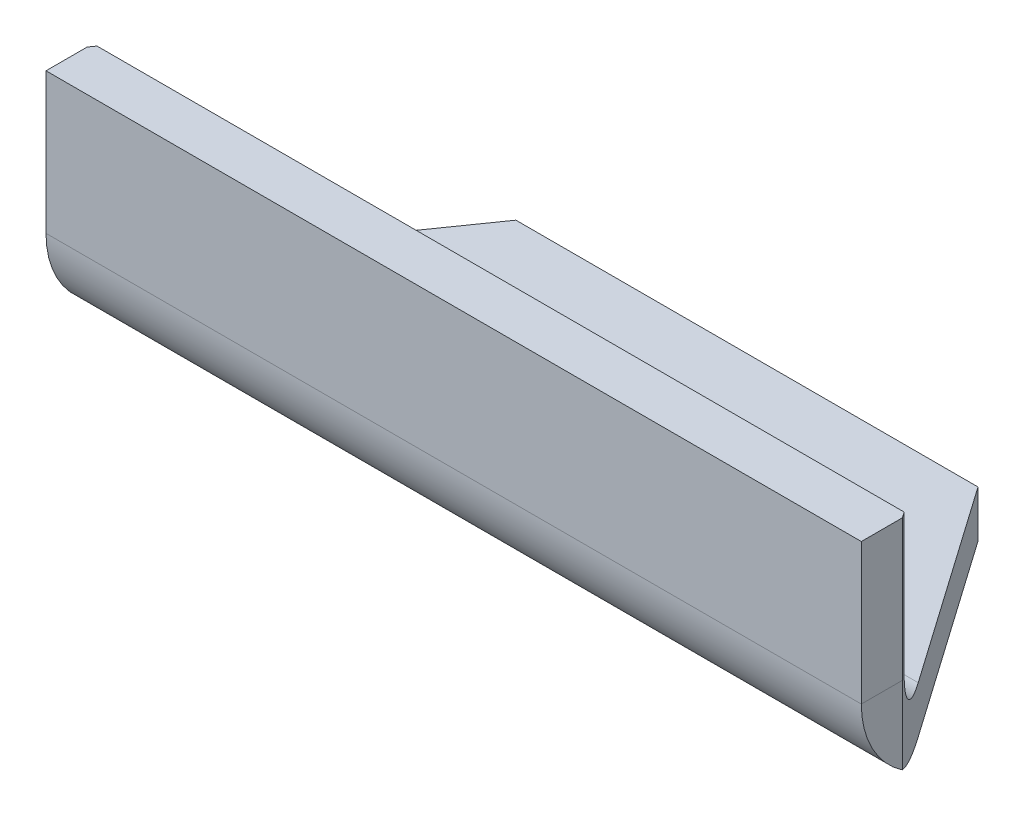
ISO-10303-21;
HEADER;
FILE_DESCRIPTION(('STEP AP214'),'2;1');
FILE_NAME('part.step','',(''),(''),'','','');
FILE_SCHEMA(('AUTOMOTIVE_DESIGN { 1 0 10303 214 1 1 1 1 }'));
ENDSEC;
DATA;
#1=APPLICATION_CONTEXT('core data for automotive mechanical design processes');
#2=APPLICATION_PROTOCOL_DEFINITION('international standard','automotive_design',2000,#1);
#3=PRODUCT_CONTEXT('',#1,'mechanical');
#4=PRODUCT('Part','Part','',(#3));
#5=PRODUCT_RELATED_PRODUCT_CATEGORY('part','',(#4));
#6=PRODUCT_DEFINITION_FORMATION('','',#4);
#7=PRODUCT_DEFINITION_CONTEXT('part definition',#1,'design');
#8=PRODUCT_DEFINITION('design','',#6,#7);
#9=PRODUCT_DEFINITION_SHAPE('','',#8);
#10=(LENGTH_UNIT() NAMED_UNIT(*) SI_UNIT(.MILLI.,.METRE.));
#11=(NAMED_UNIT(*) PLANE_ANGLE_UNIT() SI_UNIT($,.RADIAN.));
#12=(NAMED_UNIT(*) SI_UNIT($,.STERADIAN.) SOLID_ANGLE_UNIT());
#13=UNCERTAINTY_MEASURE_WITH_UNIT(LENGTH_MEASURE(1.E-05),#10,'distance_accuracy_value','');
#14=(GEOMETRIC_REPRESENTATION_CONTEXT(3) GLOBAL_UNCERTAINTY_ASSIGNED_CONTEXT((#13)) GLOBAL_UNIT_ASSIGNED_CONTEXT((#10,
#11,#12)) REPRESENTATION_CONTEXT('',''));
#15=CARTESIAN_POINT('',(0.,0.,0.));
#16=DIRECTION('',(0.,0.,1.));
#17=DIRECTION('',(1.,0.,0.));
#18=AXIS2_PLACEMENT_3D('',#15,#16,#17);
#19=CARTESIAN_POINT('',(0.,-8.,0.));
#20=DIRECTION('',(0.,-1.,0.));
#21=DIRECTION('',(0.,0.,-1.));
#22=AXIS2_PLACEMENT_3D('',#19,#20,#21);
#23=PLANE('',#22);
#24=DIRECTION('',(-1.,0.,0.));
#25=VECTOR('',#24,1.);
#26=CARTESIAN_POINT('',(-69.5,-8.,-25.));
#27=LINE('',#26,#25);
#28=CARTESIAN_POINT('',(39.3910758569819,-8.,-25.));
#29=VERTEX_POINT('',#28);
#30=CARTESIAN_POINT('',(-39.3910758569819,-8.,-25.));
#31=VERTEX_POINT('',#30);
#32=EDGE_CURVE('E168',#29,#31,#27,.T.);
#33=ORIENTED_EDGE('',*,*,#32,.F.);
#34=DIRECTION('',(0.573576436351051,0.,0.819152044288988));
#35=VECTOR('',#34,1.);
#36=CARTESIAN_POINT('',(38.1779663934933,-8.,-26.7324998622413));
#37=LINE('',#36,#35);
#38=CARTESIAN_POINT('',(63.1981321561124,-8.00000000000003,9.00000000000001));
#39=VERTEX_POINT('',#38);
#40=EDGE_CURVE('E196',#39,#29,#37,.F.);
#41=ORIENTED_EDGE('',*,*,#40,.F.);
#42=DIRECTION('',(1.,0.,0.));
#43=VECTOR('',#42,1.);
#44=CARTESIAN_POINT('',(69.5,-8.00000000000003,9.00000000000001));
#45=LINE('',#44,#43);
#46=CARTESIAN_POINT('',(-63.1981321561124,-8.00000000000003,9.00000000000001));
#47=VERTEX_POINT('',#46);
#48=EDGE_CURVE('E81',#39,#47,#45,.F.);
#49=ORIENTED_EDGE('',*,*,#48,.T.);
#50=DIRECTION('',(-0.573576436351051,0.,0.819152044288988));
#51=VECTOR('',#50,1.);
#52=CARTESIAN_POINT('',(-38.1779663934933,-8.,-26.7324998622413));
#53=LINE('',#52,#51);
#54=EDGE_CURVE('E13',#47,#31,#53,.F.);
#55=ORIENTED_EDGE('',*,*,#54,.T.);
#56=EDGE_LOOP('',(#33,#41,#49,#55));
#57=FACE_BOUND('',#56,.T.);
#58=ADVANCED_FACE('F58',(#57),#23,.T.);
#59=CARTESIAN_POINT('',(0.,0.,0.));
#60=DIRECTION('',(0.,-1.,0.));
#61=DIRECTION('',(0.,0.,-1.));
#62=AXIS2_PLACEMENT_3D('',#59,#60,#61);
#63=PLANE('',#62);
#64=DIRECTION('',(-0.573576436351051,0.,-0.819152044288988));
#65=VECTOR('',#64,1.);
#66=CARTESIAN_POINT('',(39.3910758569819,0.,-25.));
#67=LINE('',#66,#65);
#68=CARTESIAN_POINT('',(39.3910758569819,0.,-25.));
#69=VERTEX_POINT('',#68);
#70=CARTESIAN_POINT('',(63.1981321561124,0.,9.00000000000001));
#71=VERTEX_POINT('',#70);
#72=EDGE_CURVE('E203',#69,#71,#67,.F.);
#73=ORIENTED_EDGE('',*,*,#72,.F.);
#74=DIRECTION('',(-1.,0.,0.));
#75=VECTOR('',#74,1.);
#76=CARTESIAN_POINT('',(-69.5,0.,-25.));
#77=LINE('',#76,#75);
#78=CARTESIAN_POINT('',(-39.3910758569819,0.,-25.));
#79=VERTEX_POINT('',#78);
#80=EDGE_CURVE('E171',#69,#79,#77,.T.);
#81=ORIENTED_EDGE('',*,*,#80,.T.);
#82=DIRECTION('',(0.573576436351051,0.,-0.819152044288988));
#83=VECTOR('',#82,1.);
#84=CARTESIAN_POINT('',(-39.3910758569819,0.,-25.));
#85=LINE('',#84,#83);
#86=CARTESIAN_POINT('',(-63.1981321561124,0.,9.00000000000001));
#87=VERTEX_POINT('',#86);
#88=EDGE_CURVE('E175',#79,#87,#85,.F.);
#89=ORIENTED_EDGE('',*,*,#88,.T.);
#90=DIRECTION('',(1.,0.,0.));
#91=VECTOR('',#90,1.);
#92=CARTESIAN_POINT('',(69.5,0.,9.00000000000001));
#93=LINE('',#92,#91);
#94=EDGE_CURVE('E160',#71,#87,#93,.F.);
#95=ORIENTED_EDGE('',*,*,#94,.F.);
#96=EDGE_LOOP('',(#73,#81,#89,#95));
#97=FACE_BOUND('',#96,.T.);
#98=ADVANCED_FACE('F261',(#97),#63,.F.);
#99=CARTESIAN_POINT('',(-69.5,-8.,-25.));
#100=DIRECTION('',(0.,0.,-1.));
#101=DIRECTION('',(-1.,0.,0.));
#102=AXIS2_PLACEMENT_3D('',#99,#100,#101);
#103=PLANE('',#102);
#104=ORIENTED_EDGE('',*,*,#80,.F.);
#105=DIRECTION('',(0.,1.,0.));
#106=VECTOR('',#105,1.);
#107=CARTESIAN_POINT('',(39.3910758569819,-8.,-25.));
#108=LINE('',#107,#106);
#109=EDGE_CURVE('E201',#29,#69,#108,.T.);
#110=ORIENTED_EDGE('',*,*,#109,.F.);
#111=ORIENTED_EDGE('',*,*,#32,.T.);
#112=DIRECTION('',(0.,1.,0.));
#113=VECTOR('',#112,1.);
#114=CARTESIAN_POINT('',(-39.3910758569819,-8.,-25.));
#115=LINE('',#114,#113);
#116=EDGE_CURVE('E170',#31,#79,#115,.T.);
#117=ORIENTED_EDGE('',*,*,#116,.T.);
#118=EDGE_LOOP('',(#104,#110,#111,#117));
#119=FACE_BOUND('',#118,.T.);
#120=ADVANCED_FACE('F200',(#119),#103,.T.);
#121=CARTESIAN_POINT('',(69.5,7.99999999999997,9.00000000000001));
#122=DIRECTION('',(-1.,0.,0.));
#123=DIRECTION('',(0.,0.,1.));
#124=AXIS2_PLACEMENT_3D('',#121,#122,#123);
#125=PLANE('',#124);
#126=CARTESIAN_POINT('',(69.5,7.99999999999997,9.00000000000001));
#127=DIRECTION('',(1.,0.,0.));
#128=DIRECTION('',(0.,0.,-1.));
#129=AXIS2_PLACEMENT_3D('',#126,#127,#128);
#130=CIRCLE('',#129,16.);
#131=CARTESIAN_POINT('',(69.5,7.99999999999997,25.));
#132=VERTEX_POINT('',#131);
#133=CARTESIAN_POINT('',(69.5,-5.22875655532285,18.0000000000002));
#134=VERTEX_POINT('',#133);
#135=EDGE_CURVE('E155',#132,#134,#130,.T.);
#136=ORIENTED_EDGE('',*,*,#135,.T.);
#137=DIRECTION('',(0.,-1.,0.));
#138=VECTOR('',#137,1.);
#139=CARTESIAN_POINT('',(69.5,7.99999999999997,18.0000000000002));
#140=LINE('',#139,#138);
#141=CARTESIAN_POINT('',(69.5,7.99999999999997,18.0000000000002));
#142=VERTEX_POINT('',#141);
#143=EDGE_CURVE('E141',#142,#134,#140,.T.);
#144=ORIENTED_EDGE('',*,*,#143,.F.);
#145=DIRECTION('',(0.,0.,-1.));
#146=VECTOR('',#145,1.);
#147=CARTESIAN_POINT('',(69.5,7.99999999999997,17.));
#148=LINE('',#147,#146);
#149=EDGE_CURVE('E159',#142,#132,#148,.F.);
#150=ORIENTED_EDGE('',*,*,#149,.T.);
#151=EDGE_LOOP('',(#136,#144,#150));
#152=FACE_BOUND('',#151,.T.);
#153=ADVANCED_FACE('F158',(#152),#125,.F.);
#154=CARTESIAN_POINT('',(69.5,7.99999999999997,9.00000000000001));
#155=DIRECTION('',(1.,0.,0.));
#156=DIRECTION('',(0.,0.,1.));
#157=AXIS2_PLACEMENT_3D('',#154,#155,#156);
#158=CYLINDRICAL_SURFACE('',#157,16.);
#159=ORIENTED_EDGE('',*,*,#48,.F.);
#160=CARTESIAN_POINT('',(63.1981321561124,7.99999999999997,9.00000000000001));
#161=DIRECTION('',(0.819152044288988,0.,-0.573576436351051));
#162=DIRECTION('',(-0.573576436351051,0.,-0.819152044288988));
#163=AXIS2_PLACEMENT_3D('',#160,#161,#162);
#164=ELLIPSE('',#163,19.5323934201834,16.);
#165=EDGE_CURVE('E144',#134,#39,#164,.T.);
#166=ORIENTED_EDGE('',*,*,#165,.F.);
#167=ORIENTED_EDGE('',*,*,#135,.F.);
#168=DIRECTION('',(1.,0.,0.));
#169=VECTOR('',#168,1.);
#170=CARTESIAN_POINT('',(-69.5,7.99999999999997,25.));
#171=LINE('',#170,#169);
#172=CARTESIAN_POINT('',(-69.5,7.99999999999997,25.));
#173=VERTEX_POINT('',#172);
#174=EDGE_CURVE('E225',#132,#173,#171,.F.);
#175=ORIENTED_EDGE('',*,*,#174,.T.);
#176=CARTESIAN_POINT('',(-69.5,7.99999999999997,9.00000000000001));
#177=DIRECTION('',(1.,0.,0.));
#178=DIRECTION('',(0.,0.,-1.));
#179=AXIS2_PLACEMENT_3D('',#176,#177,#178);
#180=CIRCLE('',#179,16.);
#181=CARTESIAN_POINT('',(-69.5,-5.22875655532285,18.0000000000002));
#182=VERTEX_POINT('',#181);
#183=EDGE_CURVE('E162',#182,#173,#180,.F.);
#184=ORIENTED_EDGE('',*,*,#183,.F.);
#185=CARTESIAN_POINT('',(-63.1981321561124,7.99999999999997,9.00000000000001));
#186=DIRECTION('',(0.819152044288988,0.,0.573576436351051));
#187=DIRECTION('',(0.573576436351051,0.,-0.819152044288988));
#188=AXIS2_PLACEMENT_3D('',#185,#186,#187);
#189=ELLIPSE('',#188,19.5323934201834,16.);
#190=EDGE_CURVE('E67',#182,#47,#189,.T.);
#191=ORIENTED_EDGE('',*,*,#190,.T.);
#192=EDGE_LOOP('',(#159,#166,#167,#175,#184,#191));
#193=FACE_BOUND('',#192,.T.);
#194=ADVANCED_FACE('F153',(#193),#158,.T.);
#195=CARTESIAN_POINT('',(69.5,7.99999999999997,9.00000000000001));
#196=DIRECTION('',(1.,0.,0.));
#197=DIRECTION('',(0.,0.,1.));
#198=AXIS2_PLACEMENT_3D('',#195,#196,#197);
#199=CYLINDRICAL_SURFACE('',#198,8.);
#200=CARTESIAN_POINT('',(63.1981321561124,7.99999999999997,9.00000000000001));
#201=DIRECTION('',(0.819152044288988,0.,-0.573576436351051));
#202=DIRECTION('',(-0.573576436351051,0.,-0.819152044288988));
#203=AXIS2_PLACEMENT_3D('',#200,#201,#202);
#204=ELLIPSE('',#203,9.76619671009169,8.);
#205=CARTESIAN_POINT('',(68.7997924617902,7.99999999999997,17.));
#206=VERTEX_POINT('',#205);
#207=EDGE_CURVE('E207',#71,#206,#204,.F.);
#208=ORIENTED_EDGE('',*,*,#207,.F.);
#209=ORIENTED_EDGE('',*,*,#94,.T.);
#210=CARTESIAN_POINT('',(-63.1981321561124,7.99999999999997,9.00000000000001));
#211=DIRECTION('',(0.819152044288988,0.,0.573576436351051));
#212=DIRECTION('',(0.573576436351051,0.,-0.819152044288988));
#213=AXIS2_PLACEMENT_3D('',#210,#211,#212);
#214=ELLIPSE('',#213,9.76619671009169,8.);
#215=CARTESIAN_POINT('',(-68.7997924617902,7.99999999999997,17.));
#216=VERTEX_POINT('',#215);
#217=EDGE_CURVE('E178',#87,#216,#214,.F.);
#218=ORIENTED_EDGE('',*,*,#217,.T.);
#219=DIRECTION('',(1.,0.,0.));
#220=VECTOR('',#219,1.);
#221=CARTESIAN_POINT('',(-69.5,7.99999999999997,17.));
#222=LINE('',#221,#220);
#223=EDGE_CURVE('E228',#216,#206,#222,.T.);
#224=ORIENTED_EDGE('',*,*,#223,.T.);
#225=EDGE_LOOP('',(#208,#209,#218,#224));
#226=FACE_BOUND('',#225,.T.);
#227=ADVANCED_FACE('F275',(#226),#199,.F.);
#228=CARTESIAN_POINT('',(69.5,32.,25.));
#229=DIRECTION('',(-1.,0.,0.));
#230=DIRECTION('',(0.,0.,1.));
#231=AXIS2_PLACEMENT_3D('',#228,#229,#230);
#232=PLANE('',#231);
#233=CARTESIAN_POINT('',(69.5,32.,18.0000000000002));
#234=VERTEX_POINT('',#233);
#235=EDGE_CURVE('E146',#234,#142,#140,.T.);
#236=ORIENTED_EDGE('',*,*,#235,.F.);
#237=DIRECTION('',(0.,0.,-1.));
#238=VECTOR('',#237,1.);
#239=CARTESIAN_POINT('',(69.5,32.,25.));
#240=LINE('',#239,#238);
#241=CARTESIAN_POINT('',(69.5,32.,25.));
#242=VERTEX_POINT('',#241);
#243=EDGE_CURVE('E164',#242,#234,#240,.T.);
#244=ORIENTED_EDGE('',*,*,#243,.F.);
#245=DIRECTION('',(0.,1.,0.));
#246=VECTOR('',#245,1.);
#247=CARTESIAN_POINT('',(69.5,0.,25.));
#248=LINE('',#247,#246);
#249=EDGE_CURVE('E218',#132,#242,#248,.T.);
#250=ORIENTED_EDGE('',*,*,#249,.F.);
#251=ORIENTED_EDGE('',*,*,#149,.F.);
#252=EDGE_LOOP('',(#236,#244,#250,#251));
#253=FACE_BOUND('',#252,.T.);
#254=ADVANCED_FACE('F280',(#253),#232,.F.);
#255=CARTESIAN_POINT('',(0.,0.,17.));
#256=DIRECTION('',(0.,0.,-1.));
#257=DIRECTION('',(-1.,0.,0.));
#258=AXIS2_PLACEMENT_3D('',#255,#256,#257);
#259=PLANE('',#258);
#260=DIRECTION('',(1.,0.,0.));
#261=VECTOR('',#260,1.);
#262=CARTESIAN_POINT('',(-69.5,32.,17.));
#263=LINE('',#262,#261);
#264=CARTESIAN_POINT('',(68.7997924617901,32.,17.));
#265=VERTEX_POINT('',#264);
#266=CARTESIAN_POINT('',(-68.7997924617901,32.,17.));
#267=VERTEX_POINT('',#266);
#268=EDGE_CURVE('E223',#265,#267,#263,.F.);
#269=ORIENTED_EDGE('',*,*,#268,.F.);
#270=DIRECTION('',(0.,-1.,0.));
#271=VECTOR('',#270,1.);
#272=CARTESIAN_POINT('',(68.7997924617901,0.,17.));
#273=LINE('',#272,#271);
#274=EDGE_CURVE('E74',#206,#265,#273,.F.);
#275=ORIENTED_EDGE('',*,*,#274,.F.);
#276=ORIENTED_EDGE('',*,*,#223,.F.);
#277=DIRECTION('',(0.,-1.,0.));
#278=VECTOR('',#277,1.);
#279=CARTESIAN_POINT('',(-68.7997924617901,0.,17.));
#280=LINE('',#279,#278);
#281=EDGE_CURVE('E180',#216,#267,#280,.F.);
#282=ORIENTED_EDGE('',*,*,#281,.T.);
#283=EDGE_LOOP('',(#269,#275,#276,#282));
#284=FACE_BOUND('',#283,.T.);
#285=ADVANCED_FACE('F256',(#284),#259,.T.);
#286=CARTESIAN_POINT('',(-69.5,32.,25.));
#287=DIRECTION('',(0.,-1.,0.));
#288=DIRECTION('',(0.,0.,-1.));
#289=AXIS2_PLACEMENT_3D('',#286,#287,#288);
#290=PLANE('',#289);
#291=DIRECTION('',(-0.573576436351051,0.,-0.819152044288988));
#292=VECTOR('',#291,1.);
#293=CARTESIAN_POINT('',(39.3910758569819,32.,-25.));
#294=LINE('',#293,#292);
#295=EDGE_CURVE('E393',#265,#234,#294,.F.);
#296=ORIENTED_EDGE('',*,*,#295,.F.);
#297=ORIENTED_EDGE('',*,*,#268,.T.);
#298=DIRECTION('',(0.573576436351051,0.,-0.819152044288988));
#299=VECTOR('',#298,1.);
#300=CARTESIAN_POINT('',(-39.3910758569819,32.,-25.));
#301=LINE('',#300,#299);
#302=CARTESIAN_POINT('',(-69.5,32.,18.0000000000002));
#303=VERTEX_POINT('',#302);
#304=EDGE_CURVE('E183',#267,#303,#301,.F.);
#305=ORIENTED_EDGE('',*,*,#304,.T.);
#306=DIRECTION('',(0.,0.,-1.));
#307=VECTOR('',#306,1.);
#308=CARTESIAN_POINT('',(-69.5,32.,25.));
#309=LINE('',#308,#307);
#310=CARTESIAN_POINT('',(-69.5,32.,25.));
#311=VERTEX_POINT('',#310);
#312=EDGE_CURVE('E213',#311,#303,#309,.T.);
#313=ORIENTED_EDGE('',*,*,#312,.F.);
#314=DIRECTION('',(-1.,0.,0.));
#315=VECTOR('',#314,1.);
#316=CARTESIAN_POINT('',(0.,32.,25.));
#317=LINE('',#316,#315);
#318=EDGE_CURVE('E216',#242,#311,#317,.T.);
#319=ORIENTED_EDGE('',*,*,#318,.F.);
#320=ORIENTED_EDGE('',*,*,#243,.T.);
#321=EDGE_LOOP('',(#296,#297,#305,#313,#319,#320));
#322=FACE_BOUND('',#321,.T.);
#323=ADVANCED_FACE('F245',(#322),#290,.F.);
#324=CARTESIAN_POINT('',(-69.5,7.99999999999997,9.00000000000001));
#325=DIRECTION('',(-1.,0.,0.));
#326=DIRECTION('',(0.,0.,1.));
#327=AXIS2_PLACEMENT_3D('',#324,#325,#326);
#328=PLANE('',#327);
#329=DIRECTION('',(0.,0.,-1.));
#330=VECTOR('',#329,1.);
#331=CARTESIAN_POINT('',(-69.5,7.99999999999997,25.));
#332=LINE('',#331,#330);
#333=CARTESIAN_POINT('',(-69.5,7.99999999999997,18.0000000000002));
#334=VERTEX_POINT('',#333);
#335=EDGE_CURVE('E205',#334,#173,#332,.F.);
#336=ORIENTED_EDGE('',*,*,#335,.F.);
#337=DIRECTION('',(0.,-1.,0.));
#338=VECTOR('',#337,1.);
#339=CARTESIAN_POINT('',(-69.5,7.99999999999997,18.0000000000002));
#340=LINE('',#339,#338);
#341=EDGE_CURVE('E187',#334,#182,#340,.T.);
#342=ORIENTED_EDGE('',*,*,#341,.T.);
#343=ORIENTED_EDGE('',*,*,#183,.T.);
#344=EDGE_LOOP('',(#336,#342,#343));
#345=FACE_BOUND('',#344,.T.);
#346=ADVANCED_FACE('F248',(#345),#328,.T.);
#347=CARTESIAN_POINT('',(-69.5,0.,25.));
#348=DIRECTION('',(1.,0.,0.));
#349=DIRECTION('',(0.,0.,-1.));
#350=AXIS2_PLACEMENT_3D('',#347,#348,#349);
#351=PLANE('',#350);
#352=ORIENTED_EDGE('',*,*,#312,.T.);
#353=DIRECTION('',(0.,1.,0.));
#354=VECTOR('',#353,1.);
#355=CARTESIAN_POINT('',(-69.5,-8.,18.0000000000002));
#356=LINE('',#355,#354);
#357=EDGE_CURVE('E185',#303,#334,#356,.F.);
#358=ORIENTED_EDGE('',*,*,#357,.T.);
#359=ORIENTED_EDGE('',*,*,#335,.T.);
#360=DIRECTION('',(0.,-1.,0.));
#361=VECTOR('',#360,1.);
#362=CARTESIAN_POINT('',(-69.5,0.,25.));
#363=LINE('',#362,#361);
#364=EDGE_CURVE('E220',#311,#173,#363,.T.);
#365=ORIENTED_EDGE('',*,*,#364,.F.);
#366=EDGE_LOOP('',(#352,#358,#359,#365));
#367=FACE_BOUND('',#366,.T.);
#368=ADVANCED_FACE('F235',(#367),#351,.F.);
#369=CARTESIAN_POINT('',(0.,0.,25.));
#370=DIRECTION('',(0.,0.,-1.));
#371=DIRECTION('',(-1.,0.,0.));
#372=AXIS2_PLACEMENT_3D('',#369,#370,#371);
#373=PLANE('',#372);
#374=ORIENTED_EDGE('',*,*,#174,.F.);
#375=ORIENTED_EDGE('',*,*,#249,.T.);
#376=ORIENTED_EDGE('',*,*,#318,.T.);
#377=ORIENTED_EDGE('',*,*,#364,.T.);
#378=EDGE_LOOP('',(#374,#375,#376,#377));
#379=FACE_BOUND('',#378,.T.);
#380=ADVANCED_FACE('F240',(#379),#373,.F.);
#381=CARTESIAN_POINT('',(-39.3910758569819,-8.,-25.));
#382=DIRECTION('',(0.819152044288988,0.,0.573576436351051));
#383=DIRECTION('',(0.,1.,0.));
#384=AXIS2_PLACEMENT_3D('',#381,#382,#383);
#385=PLANE('',#384);
#386=ORIENTED_EDGE('',*,*,#190,.F.);
#387=ORIENTED_EDGE('',*,*,#341,.F.);
#388=ORIENTED_EDGE('',*,*,#357,.F.);
#389=ORIENTED_EDGE('',*,*,#304,.F.);
#390=ORIENTED_EDGE('',*,*,#281,.F.);
#391=ORIENTED_EDGE('',*,*,#217,.F.);
#392=ORIENTED_EDGE('',*,*,#88,.F.);
#393=ORIENTED_EDGE('',*,*,#116,.F.);
#394=ORIENTED_EDGE('',*,*,#54,.F.);
#395=EDGE_LOOP('',(#386,#387,#388,#389,#390,#391,#392,#393,#394));
#396=FACE_BOUND('',#395,.T.);
#397=ADVANCED_FACE('F61',(#396),#385,.F.);
#398=CARTESIAN_POINT('',(39.3910758569819,-8.,-25.));
#399=DIRECTION('',(-0.819152044288988,0.,0.573576436351051));
#400=DIRECTION('',(0.,1.,0.));
#401=AXIS2_PLACEMENT_3D('',#398,#399,#400);
#402=PLANE('',#401);
#403=ORIENTED_EDGE('',*,*,#165,.T.);
#404=ORIENTED_EDGE('',*,*,#40,.T.);
#405=ORIENTED_EDGE('',*,*,#109,.T.);
#406=ORIENTED_EDGE('',*,*,#72,.T.);
#407=ORIENTED_EDGE('',*,*,#207,.T.);
#408=ORIENTED_EDGE('',*,*,#274,.T.);
#409=ORIENTED_EDGE('',*,*,#295,.T.);
#410=ORIENTED_EDGE('',*,*,#235,.T.);
#411=ORIENTED_EDGE('',*,*,#143,.T.);
#412=EDGE_LOOP('',(#403,#404,#405,#406,#407,#408,#409,#410,#411));
#413=FACE_BOUND('',#412,.T.);
#414=ADVANCED_FACE('F143',(#413),#402,.F.);
#415=CLOSED_SHELL('',(#58,#98,#120,#153,#194,#227,#254,#285,#323,#346,#368,#380,#397,#414));
#416=MANIFOLD_SOLID_BREP('B2',#415);
#417=ADVANCED_BREP_SHAPE_REPRESENTATION('',(#18,#416),#14);
#418=SHAPE_DEFINITION_REPRESENTATION(#9,#417);
ENDSEC;
END-ISO-10303-21;
